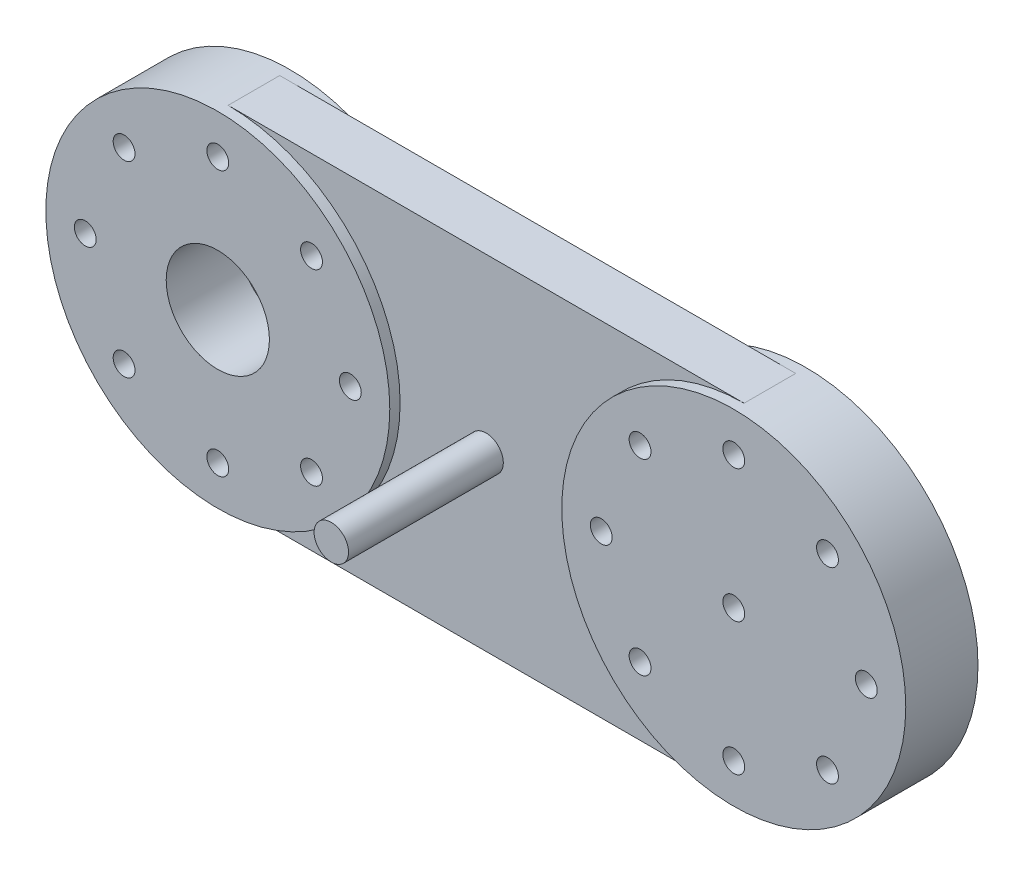
ISO-10303-21;
HEADER;
FILE_DESCRIPTION(('STEP AP214'),'2;1');
FILE_NAME('part.step','',(''),(''),'','','');
FILE_SCHEMA(('AUTOMOTIVE_DESIGN { 1 0 10303 214 1 1 1 1 }'));
ENDSEC;
DATA;
#1=APPLICATION_CONTEXT('core data for automotive mechanical design processes');
#2=APPLICATION_PROTOCOL_DEFINITION('international standard','automotive_design',2000,#1);
#3=PRODUCT_CONTEXT('',#1,'mechanical');
#4=PRODUCT('Part','Part','',(#3));
#5=PRODUCT_RELATED_PRODUCT_CATEGORY('part','',(#4));
#6=PRODUCT_DEFINITION_FORMATION('','',#4);
#7=PRODUCT_DEFINITION_CONTEXT('part definition',#1,'design');
#8=PRODUCT_DEFINITION('design','',#6,#7);
#9=PRODUCT_DEFINITION_SHAPE('','',#8);
#10=(LENGTH_UNIT() NAMED_UNIT(*) SI_UNIT(.MILLI.,.METRE.));
#11=(NAMED_UNIT(*) PLANE_ANGLE_UNIT() SI_UNIT($,.RADIAN.));
#12=(NAMED_UNIT(*) SI_UNIT($,.STERADIAN.) SOLID_ANGLE_UNIT());
#13=UNCERTAINTY_MEASURE_WITH_UNIT(LENGTH_MEASURE(1.E-05),#10,'distance_accuracy_value','');
#14=(GEOMETRIC_REPRESENTATION_CONTEXT(3) GLOBAL_UNCERTAINTY_ASSIGNED_CONTEXT((#13)) GLOBAL_UNIT_ASSIGNED_CONTEXT((#10,
#11,#12)) REPRESENTATION_CONTEXT('',''));
#15=CARTESIAN_POINT('',(0.,0.,0.));
#16=DIRECTION('',(0.,0.,1.));
#17=DIRECTION('',(1.,0.,0.));
#18=AXIS2_PLACEMENT_3D('',#15,#16,#17);
#19=CARTESIAN_POINT('',(0.,0.,-15.));
#20=DIRECTION('',(0.,1.,0.));
#21=DIRECTION('',(-1.,0.,0.));
#22=AXIS2_PLACEMENT_3D('',#19,#20,#21);
#23=PLANE('',#22);
#24=DIRECTION('',(-1.,0.,0.));
#25=VECTOR('',#24,1.);
#26=CARTESIAN_POINT('',(0.,0.,0.));
#27=LINE('',#26,#25);
#28=CARTESIAN_POINT('',(0.,0.,0.));
#29=VERTEX_POINT('',#28);
#30=CARTESIAN_POINT('',(-150.,0.,0.));
#31=VERTEX_POINT('',#30);
#32=EDGE_CURVE('E71',#29,#31,#27,.T.);
#33=ORIENTED_EDGE('',*,*,#32,.T.);
#34=DIRECTION('',(0.,0.,1.));
#35=VECTOR('',#34,1.);
#36=CARTESIAN_POINT('',(-150.,0.,-15.));
#37=LINE('',#36,#35);
#38=CARTESIAN_POINT('',(-150.,0.,-15.));
#39=VERTEX_POINT('',#38);
#40=EDGE_CURVE('E86',#39,#31,#37,.T.);
#41=ORIENTED_EDGE('',*,*,#40,.F.);
#42=DIRECTION('',(-1.,0.,0.));
#43=VECTOR('',#42,1.);
#44=CARTESIAN_POINT('',(0.,0.,-15.));
#45=LINE('',#44,#43);
#46=CARTESIAN_POINT('',(0.,0.,-15.));
#47=VERTEX_POINT('',#46);
#48=EDGE_CURVE('E83',#47,#39,#45,.T.);
#49=ORIENTED_EDGE('',*,*,#48,.F.);
#50=DIRECTION('',(0.,0.,1.));
#51=VECTOR('',#50,1.);
#52=CARTESIAN_POINT('',(0.,0.,-15.));
#53=LINE('',#52,#51);
#54=EDGE_CURVE('E44',#47,#29,#53,.T.);
#55=ORIENTED_EDGE('',*,*,#54,.T.);
#56=EDGE_LOOP('',(#33,#41,#49,#55));
#57=FACE_BOUND('',#56,.T.);
#58=ADVANCED_FACE('F36',(#57),#23,.F.);
#59=CARTESIAN_POINT('',(0.,100.,-15.));
#60=DIRECTION('',(0.,1.,0.));
#61=DIRECTION('',(-1.,0.,0.));
#62=AXIS2_PLACEMENT_3D('',#59,#60,#61);
#63=PLANE('',#62);
#64=DIRECTION('',(-1.,0.,0.));
#65=VECTOR('',#64,1.);
#66=CARTESIAN_POINT('',(0.,100.,0.));
#67=LINE('',#66,#65);
#68=CARTESIAN_POINT('',(0.,100.,0.));
#69=VERTEX_POINT('',#68);
#70=CARTESIAN_POINT('',(-150.,100.,0.));
#71=VERTEX_POINT('',#70);
#72=EDGE_CURVE('E79',#69,#71,#67,.T.);
#73=ORIENTED_EDGE('',*,*,#72,.F.);
#74=DIRECTION('',(0.,0.,1.));
#75=VECTOR('',#74,1.);
#76=CARTESIAN_POINT('',(0.,100.,-15.));
#77=LINE('',#76,#75);
#78=CARTESIAN_POINT('',(0.,100.,-15.));
#79=VERTEX_POINT('',#78);
#80=EDGE_CURVE('E90',#79,#69,#77,.T.);
#81=ORIENTED_EDGE('',*,*,#80,.F.);
#82=DIRECTION('',(-1.,0.,0.));
#83=VECTOR('',#82,1.);
#84=CARTESIAN_POINT('',(0.,100.,-15.));
#85=LINE('',#84,#83);
#86=CARTESIAN_POINT('',(-150.,100.,-15.));
#87=VERTEX_POINT('',#86);
#88=EDGE_CURVE('E78',#79,#87,#85,.T.);
#89=ORIENTED_EDGE('',*,*,#88,.T.);
#90=DIRECTION('',(0.,0.,1.));
#91=VECTOR('',#90,1.);
#92=CARTESIAN_POINT('',(-150.,100.,-15.));
#93=LINE('',#92,#91);
#94=EDGE_CURVE('E108',#87,#71,#93,.T.);
#95=ORIENTED_EDGE('',*,*,#94,.T.);
#96=EDGE_LOOP('',(#73,#81,#89,#95));
#97=FACE_BOUND('',#96,.T.);
#98=ADVANCED_FACE('F38',(#97),#63,.T.);
#99=CARTESIAN_POINT('',(0.,0.,-15.));
#100=DIRECTION('',(0.,0.,1.));
#101=DIRECTION('',(1.,0.,0.));
#102=AXIS2_PLACEMENT_3D('',#99,#100,#101);
#103=PLANE('',#102);
#104=ORIENTED_EDGE('',*,*,#48,.T.);
#105=CARTESIAN_POINT('',(-150.,50.,-15.));
#106=DIRECTION('',(0.,0.,1.));
#107=DIRECTION('',(1.,0.,0.));
#108=AXIS2_PLACEMENT_3D('',#105,#106,#107);
#109=CIRCLE('',#108,50.);
#110=EDGE_CURVE('E92',#39,#87,#109,.T.);
#111=ORIENTED_EDGE('',*,*,#110,.T.);
#112=ORIENTED_EDGE('',*,*,#88,.F.);
#113=CARTESIAN_POINT('',(0.,50.,-15.));
#114=DIRECTION('',(0.,0.,1.));
#115=DIRECTION('',(1.,0.,0.));
#116=AXIS2_PLACEMENT_3D('',#113,#114,#115);
#117=CIRCLE('',#116,50.);
#118=EDGE_CURVE('E97',#79,#47,#117,.T.);
#119=ORIENTED_EDGE('',*,*,#118,.T.);
#120=EDGE_LOOP('',(#104,#111,#112,#119));
#121=FACE_BOUND('',#120,.T.);
#122=ADVANCED_FACE('F117',(#121),#103,.F.);
#123=CARTESIAN_POINT('',(0.,0.,0.));
#124=DIRECTION('',(0.,0.,1.));
#125=DIRECTION('',(1.,0.,0.));
#126=AXIS2_PLACEMENT_3D('',#123,#124,#125);
#127=PLANE('',#126);
#128=CARTESIAN_POINT('',(-150.,50.,0.));
#129=DIRECTION('',(0.,0.,1.));
#130=DIRECTION('',(1.,0.,0.));
#131=AXIS2_PLACEMENT_3D('',#128,#129,#130);
#132=CIRCLE('',#131,50.);
#133=EDGE_CURVE('E11',#31,#71,#132,.T.);
#134=ORIENTED_EDGE('',*,*,#133,.F.);
#135=ORIENTED_EDGE('',*,*,#32,.F.);
#136=CARTESIAN_POINT('',(0.,50.,0.));
#137=DIRECTION('',(0.,0.,1.));
#138=DIRECTION('',(1.,0.,0.));
#139=AXIS2_PLACEMENT_3D('',#136,#137,#138);
#140=CIRCLE('',#139,50.);
#141=EDGE_CURVE('E54',#69,#29,#140,.T.);
#142=ORIENTED_EDGE('',*,*,#141,.F.);
#143=ORIENTED_EDGE('',*,*,#72,.T.);
#144=EDGE_LOOP('',(#134,#135,#142,#143));
#145=FACE_BOUND('',#144,.T.);
#146=CARTESIAN_POINT('',(-75.,50.,0.));
#147=DIRECTION('',(0.,0.,1.));
#148=DIRECTION('',(1.,0.,0.));
#149=AXIS2_PLACEMENT_3D('',#146,#147,#148);
#150=CIRCLE('',#149,5.00000000000001);
#151=CARTESIAN_POINT('',(-80.,50.,0.));
#152=VERTEX_POINT('',#151);
#153=EDGE_CURVE('E91',#152,#152,#150,.T.);
#154=ORIENTED_EDGE('',*,*,#153,.F.);
#155=EDGE_LOOP('',(#154));
#156=FACE_BOUND('',#155,.T.);
#157=ADVANCED_FACE('F73',(#145,#156),#127,.T.);
#158=CARTESIAN_POINT('',(-75.,50.,45.));
#159=DIRECTION('',(0.,0.,-1.));
#160=DIRECTION('',(-1.,0.,0.));
#161=AXIS2_PLACEMENT_3D('',#158,#159,#160);
#162=CYLINDRICAL_SURFACE('',#161,5.00000000000001);
#163=CARTESIAN_POINT('',(-75.,50.,45.));
#164=DIRECTION('',(0.,0.,1.));
#165=DIRECTION('',(1.,0.,0.));
#166=AXIS2_PLACEMENT_3D('',#163,#164,#165);
#167=CIRCLE('',#166,5.00000000000001);
#168=CARTESIAN_POINT('',(-80.,50.,45.));
#169=VERTEX_POINT('',#168);
#170=EDGE_CURVE('E95',#169,#169,#167,.T.);
#171=CARTESIAN_POINT('',(-80.,50.,45.));
#172=CARTESIAN_POINT('',(-80.,50.,44.53125));
#173=CARTESIAN_POINT('',(-80.,50.,44.0625));
#174=CARTESIAN_POINT('',(-80.,50.,43.125));
#175=CARTESIAN_POINT('',(-80.,50.,42.65625));
#176=CARTESIAN_POINT('',(-80.,50.,41.71875));
#177=CARTESIAN_POINT('',(-80.,50.,41.25));
#178=CARTESIAN_POINT('',(-80.,50.,40.3125));
#179=CARTESIAN_POINT('',(-80.,50.,39.84375));
#180=CARTESIAN_POINT('',(-80.,50.,38.90625));
#181=CARTESIAN_POINT('',(-80.,50.,38.4375));
#182=CARTESIAN_POINT('',(-80.,50.,37.5));
#183=CARTESIAN_POINT('',(-80.,50.,37.03125));
#184=CARTESIAN_POINT('',(-80.,50.,36.09375));
#185=CARTESIAN_POINT('',(-80.,50.,35.625));
#186=CARTESIAN_POINT('',(-80.,50.,34.6875));
#187=CARTESIAN_POINT('',(-80.,50.,34.21875));
#188=CARTESIAN_POINT('',(-80.,50.,33.28125));
#189=CARTESIAN_POINT('',(-80.,50.,32.8125));
#190=CARTESIAN_POINT('',(-80.,50.,31.875));
#191=CARTESIAN_POINT('',(-80.,50.,31.40625));
#192=CARTESIAN_POINT('',(-80.,50.,30.46875));
#193=CARTESIAN_POINT('',(-80.,50.,30.));
#194=CARTESIAN_POINT('',(-80.,50.,29.0625));
#195=CARTESIAN_POINT('',(-80.,50.,28.59375));
#196=CARTESIAN_POINT('',(-80.,50.,27.65625));
#197=CARTESIAN_POINT('',(-80.,50.,27.1875));
#198=CARTESIAN_POINT('',(-80.,50.,26.25));
#199=CARTESIAN_POINT('',(-80.,50.,25.78125));
#200=CARTESIAN_POINT('',(-80.,50.,24.84375));
#201=CARTESIAN_POINT('',(-80.,50.,24.375));
#202=CARTESIAN_POINT('',(-80.,50.,23.4375));
#203=CARTESIAN_POINT('',(-80.,50.,22.96875));
#204=CARTESIAN_POINT('',(-80.,50.,22.03125));
#205=CARTESIAN_POINT('',(-80.,50.,21.5625));
#206=CARTESIAN_POINT('',(-80.,50.,20.625));
#207=CARTESIAN_POINT('',(-80.,50.,20.15625));
#208=CARTESIAN_POINT('',(-80.,50.,19.21875));
#209=CARTESIAN_POINT('',(-80.,50.,18.75));
#210=CARTESIAN_POINT('',(-80.,50.,17.8125));
#211=CARTESIAN_POINT('',(-80.,50.,17.34375));
#212=CARTESIAN_POINT('',(-80.,50.,16.40625));
#213=CARTESIAN_POINT('',(-80.,50.,15.9375));
#214=CARTESIAN_POINT('',(-80.,50.,15.));
#215=CARTESIAN_POINT('',(-80.,50.,14.53125));
#216=CARTESIAN_POINT('',(-80.,50.,13.59375));
#217=CARTESIAN_POINT('',(-80.,50.,13.125));
#218=CARTESIAN_POINT('',(-80.,50.,12.1875));
#219=CARTESIAN_POINT('',(-80.,50.,11.71875));
#220=CARTESIAN_POINT('',(-80.,50.,10.78125));
#221=CARTESIAN_POINT('',(-80.,50.,10.3125));
#222=CARTESIAN_POINT('',(-80.,50.,9.375));
#223=CARTESIAN_POINT('',(-80.,50.,8.90625));
#224=CARTESIAN_POINT('',(-80.,50.,7.96874999999999));
#225=CARTESIAN_POINT('',(-80.,50.,7.5));
#226=CARTESIAN_POINT('',(-80.,50.,6.5625));
#227=CARTESIAN_POINT('',(-80.,50.,6.09375));
#228=CARTESIAN_POINT('',(-80.,50.,5.15625));
#229=CARTESIAN_POINT('',(-80.,50.,4.68749999999999));
#230=CARTESIAN_POINT('',(-80.,50.,3.74999999999999));
#231=CARTESIAN_POINT('',(-80.,50.,3.28124999999999));
#232=CARTESIAN_POINT('',(-80.,50.,2.34374999999999));
#233=CARTESIAN_POINT('',(-80.,50.,1.87499999999999));
#234=CARTESIAN_POINT('',(-80.,50.,0.937499999999992));
#235=CARTESIAN_POINT('',(-80.,50.,0.468749999999993));
#236=CARTESIAN_POINT('',(-80.,50.,0.));
#237=B_SPLINE_CURVE_WITH_KNOTS('',3,(#171,#172,#173,#174,#175,#176,#177,#178,#179,#180,#181,
#182,#183,#184,#185,#186,#187,#188,#189,#190,#191,#192,#193,#194,#195,#196,#197,#198,#199,#200,
#201,#202,#203,#204,#205,#206,#207,#208,#209,#210,#211,#212,#213,#214,#215,#216,#217,#218,#219,
#220,#221,#222,#223,#224,#225,#226,#227,#228,#229,#230,#231,#232,#233,#234,#235,#236),
.UNSPECIFIED.,.F.,.F.,(4,2,2,2,2,2,2,2,2,2,2,2,2,2,2,2,2,2,2,2,2,2,2,2,2,2,2,2,2,2,2,2,4),(0.,
1.40625,2.8125,4.21875000000001,5.62500000000001,7.03125,8.4375,9.84375000000001,11.25,12.65625,
14.0625,15.46875,16.875,18.28125,19.6875,21.09375,22.5,23.90625,25.3125,26.71875,28.125,
29.53125,30.9375,32.34375,33.75,35.15625,36.5625,37.96875,39.375,40.78125,42.1875,43.59375,45.),.UNSPECIFIED.);
#238=EDGE_CURVE('BSEAM287',#169,#152,#237,.T.);
#239=ORIENTED_EDGE('',*,*,#170,.F.);
#240=ORIENTED_EDGE('',*,*,#153,.T.);
#241=ORIENTED_EDGE('',*,*,#238,.T.);
#242=ORIENTED_EDGE('',*,*,#238,.F.);
#243=EDGE_LOOP('',(#239,#241,#240,#242));
#244=FACE_BOUND('',#243,.T.);
#245=ADVANCED_FACE('F287',(#244),#162,.T.);
#246=CARTESIAN_POINT('',(-75.,50.,45.));
#247=DIRECTION('',(0.,0.,1.));
#248=DIRECTION('',(1.,0.,0.));
#249=AXIS2_PLACEMENT_3D('',#246,#247,#248);
#250=PLANE('',#249);
#251=ORIENTED_EDGE('',*,*,#170,.T.);
#252=EDGE_LOOP('',(#251));
#253=FACE_BOUND('',#252,.T.);
#254=ADVANCED_FACE('F292',(#253),#250,.T.);
#255=CARTESIAN_POINT('',(-150.,50.,3.));
#256=DIRECTION('',(0.,0.,-1.));
#257=DIRECTION('',(-1.,0.,0.));
#258=AXIS2_PLACEMENT_3D('',#255,#256,#257);
#259=CYLINDRICAL_SURFACE('',#258,50.);
#260=CARTESIAN_POINT('',(-150.,50.,3.));
#261=DIRECTION('',(0.,0.,1.));
#262=DIRECTION('',(1.,0.,0.));
#263=AXIS2_PLACEMENT_3D('',#260,#261,#262);
#264=CIRCLE('',#263,50.);
#265=CARTESIAN_POINT('',(-100.,50.,3.));
#266=VERTEX_POINT('',#265);
#267=EDGE_CURVE('E143',#266,#266,#264,.T.);
#268=ORIENTED_EDGE('',*,*,#267,.F.);
#269=EDGE_LOOP('',(#268));
#270=FACE_BOUND('',#269,.T.);
#271=CARTESIAN_POINT('',(-150.,50.,-17.9999999999999));
#272=DIRECTION('',(0.,0.,1.));
#273=DIRECTION('',(1.,0.,0.));
#274=AXIS2_PLACEMENT_3D('',#271,#272,#273);
#275=CIRCLE('',#274,50.);
#276=CARTESIAN_POINT('',(-100.,50.,-17.9999999999999));
#277=VERTEX_POINT('',#276);
#278=EDGE_CURVE('E170',#277,#277,#275,.T.);
#279=ORIENTED_EDGE('',*,*,#278,.T.);
#280=EDGE_LOOP('',(#279));
#281=FACE_BOUND('',#280,.T.);
#282=ORIENTED_EDGE('',*,*,#94,.F.);
#283=ORIENTED_EDGE('',*,*,#110,.F.);
#284=ORIENTED_EDGE('',*,*,#40,.T.);
#285=ORIENTED_EDGE('',*,*,#133,.T.);
#286=EDGE_LOOP('',(#282,#283,#284,#285));
#287=FACE_BOUND('',#286,.T.);
#288=ADVANCED_FACE('F115',(#270,#281,#287),#259,.T.);
#289=CARTESIAN_POINT('',(-122.754935969732,22.7549359697323,3.));
#290=DIRECTION('',(0.,0.,-1.));
#291=DIRECTION('',(-1.,0.,0.));
#292=AXIS2_PLACEMENT_3D('',#289,#290,#291);
#293=CYLINDRICAL_SURFACE('',#292,3.175);
#294=CARTESIAN_POINT('',(-122.754935969732,22.7549359697323,3.));
#295=DIRECTION('',(0.,0.,1.));
#296=DIRECTION('',(1.,0.,0.));
#297=AXIS2_PLACEMENT_3D('',#294,#295,#296);
#298=CIRCLE('',#297,3.175);
#299=CARTESIAN_POINT('',(-119.579935969732,22.7549359697323,3.));
#300=VERTEX_POINT('',#299);
#301=EDGE_CURVE('E120',#300,#300,#298,.T.);
#302=ORIENTED_EDGE('',*,*,#301,.T.);
#303=EDGE_LOOP('',(#302));
#304=FACE_BOUND('',#303,.T.);
#305=CARTESIAN_POINT('',(-122.754935969732,22.7549359697323,-17.9999999999999));
#306=DIRECTION('',(0.,0.,1.));
#307=DIRECTION('',(1.,0.,0.));
#308=AXIS2_PLACEMENT_3D('',#305,#306,#307);
#309=CIRCLE('',#308,3.175);
#310=CARTESIAN_POINT('',(-119.579935969732,22.7549359697323,-17.9999999999999));
#311=VERTEX_POINT('',#310);
#312=EDGE_CURVE('E149',#311,#311,#309,.T.);
#313=ORIENTED_EDGE('',*,*,#312,.F.);
#314=EDGE_LOOP('',(#313));
#315=FACE_BOUND('',#314,.T.);
#316=ADVANCED_FACE('F298',(#304,#315),#293,.F.);
#317=CARTESIAN_POINT('',(-122.754935969734,77.2450640302665,3.));
#318=DIRECTION('',(0.,0.,-1.));
#319=DIRECTION('',(-1.,0.,0.));
#320=AXIS2_PLACEMENT_3D('',#317,#318,#319);
#321=CYLINDRICAL_SURFACE('',#320,3.175);
#322=CARTESIAN_POINT('',(-122.754935969734,77.2450640302665,3.));
#323=DIRECTION('',(0.,0.,1.));
#324=DIRECTION('',(1.,0.,0.));
#325=AXIS2_PLACEMENT_3D('',#322,#323,#324);
#326=CIRCLE('',#325,3.175);
#327=CARTESIAN_POINT('',(-119.579935969734,77.2450640302665,3.));
#328=VERTEX_POINT('',#327);
#329=EDGE_CURVE('E125',#328,#328,#326,.T.);
#330=ORIENTED_EDGE('',*,*,#329,.T.);
#331=EDGE_LOOP('',(#330));
#332=FACE_BOUND('',#331,.T.);
#333=CARTESIAN_POINT('',(-122.754935969734,77.2450640302665,-17.9999999999999));
#334=DIRECTION('',(0.,0.,1.));
#335=DIRECTION('',(1.,0.,0.));
#336=AXIS2_PLACEMENT_3D('',#333,#334,#335);
#337=CIRCLE('',#336,3.175);
#338=CARTESIAN_POINT('',(-119.579935969734,77.2450640302665,-17.9999999999999));
#339=VERTEX_POINT('',#338);
#340=EDGE_CURVE('E152',#339,#339,#337,.T.);
#341=ORIENTED_EDGE('',*,*,#340,.F.);
#342=EDGE_LOOP('',(#341));
#343=FACE_BOUND('',#342,.T.);
#344=ADVANCED_FACE('F315',(#332,#343),#321,.F.);
#345=CARTESIAN_POINT('',(-111.469660940673,50.0000000000001,3.));
#346=DIRECTION('',(0.,0.,-1.));
#347=DIRECTION('',(-1.,0.,0.));
#348=AXIS2_PLACEMENT_3D('',#345,#346,#347);
#349=CYLINDRICAL_SURFACE('',#348,3.175);
#350=CARTESIAN_POINT('',(-111.469660940673,50.0000000000001,3.));
#351=DIRECTION('',(0.,0.,1.));
#352=DIRECTION('',(1.,0.,0.));
#353=AXIS2_PLACEMENT_3D('',#350,#351,#352);
#354=CIRCLE('',#353,3.175);
#355=CARTESIAN_POINT('',(-108.294660940673,50.0000000000001,3.));
#356=VERTEX_POINT('',#355);
#357=EDGE_CURVE('E128',#356,#356,#354,.T.);
#358=ORIENTED_EDGE('',*,*,#357,.T.);
#359=EDGE_LOOP('',(#358));
#360=FACE_BOUND('',#359,.T.);
#361=CARTESIAN_POINT('',(-111.469660940673,50.0000000000001,-17.9999999999999));
#362=DIRECTION('',(0.,0.,1.));
#363=DIRECTION('',(1.,0.,0.));
#364=AXIS2_PLACEMENT_3D('',#361,#362,#363);
#365=CIRCLE('',#364,3.175);
#366=CARTESIAN_POINT('',(-108.294660940673,50.0000000000001,-17.9999999999999));
#367=VERTEX_POINT('',#366);
#368=EDGE_CURVE('E155',#367,#367,#365,.T.);
#369=ORIENTED_EDGE('',*,*,#368,.F.);
#370=EDGE_LOOP('',(#369));
#371=FACE_BOUND('',#370,.T.);
#372=ADVANCED_FACE('F311',(#360,#371),#349,.F.);
#373=CARTESIAN_POINT('',(-150.000000000001,88.5303390593257,3.));
#374=DIRECTION('',(0.,0.,-1.));
#375=DIRECTION('',(-1.,0.,0.));
#376=AXIS2_PLACEMENT_3D('',#373,#374,#375);
#377=CYLINDRICAL_SURFACE('',#376,3.17499999999999);
#378=CARTESIAN_POINT('',(-150.000000000001,88.5303390593257,3.));
#379=DIRECTION('',(0.,0.,1.));
#380=DIRECTION('',(1.,0.,0.));
#381=AXIS2_PLACEMENT_3D('',#378,#379,#380);
#382=CIRCLE('',#381,3.17499999999999);
#383=CARTESIAN_POINT('',(-146.825000000001,88.5303390593257,3.));
#384=VERTEX_POINT('',#383);
#385=EDGE_CURVE('E131',#384,#384,#382,.T.);
#386=ORIENTED_EDGE('',*,*,#385,.T.);
#387=EDGE_LOOP('',(#386));
#388=FACE_BOUND('',#387,.T.);
#389=CARTESIAN_POINT('',(-150.000000000001,88.5303390593257,-17.9999999999999));
#390=DIRECTION('',(0.,0.,1.));
#391=DIRECTION('',(1.,0.,0.));
#392=AXIS2_PLACEMENT_3D('',#389,#390,#391);
#393=CIRCLE('',#392,3.17499999999999);
#394=CARTESIAN_POINT('',(-146.825000000001,88.5303390593257,-17.9999999999999));
#395=VERTEX_POINT('',#394);
#396=EDGE_CURVE('E158',#395,#395,#393,.T.);
#397=ORIENTED_EDGE('',*,*,#396,.F.);
#398=EDGE_LOOP('',(#397));
#399=FACE_BOUND('',#398,.T.);
#400=ADVANCED_FACE('F307',(#388,#399),#377,.F.);
#401=CARTESIAN_POINT('',(-188.530339059327,49.9999999999969,3.));
#402=DIRECTION('',(0.,0.,-1.));
#403=DIRECTION('',(-1.,0.,0.));
#404=AXIS2_PLACEMENT_3D('',#401,#402,#403);
#405=CYLINDRICAL_SURFACE('',#404,3.17500000000002);
#406=CARTESIAN_POINT('',(-188.530339059327,49.9999999999969,3.));
#407=DIRECTION('',(0.,0.,1.));
#408=DIRECTION('',(1.,0.,0.));
#409=AXIS2_PLACEMENT_3D('',#406,#407,#408);
#410=CIRCLE('',#409,3.17500000000002);
#411=CARTESIAN_POINT('',(-185.355339059327,49.9999999999969,3.));
#412=VERTEX_POINT('',#411);
#413=EDGE_CURVE('E134',#412,#412,#410,.T.);
#414=ORIENTED_EDGE('',*,*,#413,.T.);
#415=EDGE_LOOP('',(#414));
#416=FACE_BOUND('',#415,.T.);
#417=CARTESIAN_POINT('',(-188.530339059327,49.9999999999969,-17.9999999999999));
#418=DIRECTION('',(0.,0.,1.));
#419=DIRECTION('',(1.,0.,0.));
#420=AXIS2_PLACEMENT_3D('',#417,#418,#419);
#421=CIRCLE('',#420,3.17500000000002);
#422=CARTESIAN_POINT('',(-185.355339059327,49.9999999999969,-17.9999999999999));
#423=VERTEX_POINT('',#422);
#424=EDGE_CURVE('E161',#423,#423,#421,.T.);
#425=ORIENTED_EDGE('',*,*,#424,.F.);
#426=EDGE_LOOP('',(#425));
#427=FACE_BOUND('',#426,.T.);
#428=ADVANCED_FACE('F303',(#416,#427),#405,.F.);
#429=CARTESIAN_POINT('',(-177.245064030266,22.7549359697301,3.));
#430=DIRECTION('',(0.,0.,-1.));
#431=DIRECTION('',(-1.,0.,0.));
#432=AXIS2_PLACEMENT_3D('',#429,#430,#431);
#433=CYLINDRICAL_SURFACE('',#432,3.17500000000001);
#434=CARTESIAN_POINT('',(-177.245064030266,22.7549359697301,3.));
#435=DIRECTION('',(0.,0.,1.));
#436=DIRECTION('',(1.,0.,0.));
#437=AXIS2_PLACEMENT_3D('',#434,#435,#436);
#438=CIRCLE('',#437,3.17500000000001);
#439=CARTESIAN_POINT('',(-174.070064030266,22.7549359697301,3.));
#440=VERTEX_POINT('',#439);
#441=EDGE_CURVE('E137',#440,#440,#438,.T.);
#442=ORIENTED_EDGE('',*,*,#441,.T.);
#443=EDGE_LOOP('',(#442));
#444=FACE_BOUND('',#443,.T.);
#445=CARTESIAN_POINT('',(-177.245064030266,22.7549359697301,-17.9999999999999));
#446=DIRECTION('',(0.,0.,1.));
#447=DIRECTION('',(1.,0.,0.));
#448=AXIS2_PLACEMENT_3D('',#445,#446,#447);
#449=CIRCLE('',#448,3.17500000000001);
#450=CARTESIAN_POINT('',(-174.070064030266,22.7549359697301,-17.9999999999999));
#451=VERTEX_POINT('',#450);
#452=EDGE_CURVE('E164',#451,#451,#449,.T.);
#453=ORIENTED_EDGE('',*,*,#452,.F.);
#454=EDGE_LOOP('',(#453));
#455=FACE_BOUND('',#454,.T.);
#456=ADVANCED_FACE('F276',(#444,#455),#433,.F.);
#457=CARTESIAN_POINT('',(-149.999999999998,11.469660940671,3.));
#458=DIRECTION('',(0.,0.,-1.));
#459=DIRECTION('',(-1.,0.,0.));
#460=AXIS2_PLACEMENT_3D('',#457,#458,#459);
#461=CYLINDRICAL_SURFACE('',#460,3.175);
#462=CARTESIAN_POINT('',(-149.999999999998,11.469660940671,3.));
#463=DIRECTION('',(0.,0.,1.));
#464=DIRECTION('',(1.,0.,0.));
#465=AXIS2_PLACEMENT_3D('',#462,#463,#464);
#466=CIRCLE('',#465,3.175);
#467=CARTESIAN_POINT('',(-146.824999999998,11.469660940671,3.));
#468=VERTEX_POINT('',#467);
#469=EDGE_CURVE('E140',#468,#468,#466,.T.);
#470=ORIENTED_EDGE('',*,*,#469,.T.);
#471=EDGE_LOOP('',(#470));
#472=FACE_BOUND('',#471,.T.);
#473=CARTESIAN_POINT('',(-149.999999999998,11.469660940671,-17.9999999999999));
#474=DIRECTION('',(0.,0.,1.));
#475=DIRECTION('',(1.,0.,0.));
#476=AXIS2_PLACEMENT_3D('',#473,#474,#475);
#477=CIRCLE('',#476,3.175);
#478=CARTESIAN_POINT('',(-146.824999999998,11.469660940671,-17.9999999999999));
#479=VERTEX_POINT('',#478);
#480=EDGE_CURVE('E167',#479,#479,#477,.T.);
#481=ORIENTED_EDGE('',*,*,#480,.F.);
#482=EDGE_LOOP('',(#481));
#483=FACE_BOUND('',#482,.T.);
#484=ADVANCED_FACE('F267',(#472,#483),#461,.F.);
#485=CARTESIAN_POINT('',(-177.245064030268,77.2450640302647,3.));
#486=DIRECTION('',(0.,0.,-1.));
#487=DIRECTION('',(-1.,0.,0.));
#488=AXIS2_PLACEMENT_3D('',#485,#486,#487);
#489=CYLINDRICAL_SURFACE('',#488,3.175);
#490=CARTESIAN_POINT('',(-177.245064030268,77.2450640302647,3.));
#491=DIRECTION('',(0.,0.,1.));
#492=DIRECTION('',(1.,0.,0.));
#493=AXIS2_PLACEMENT_3D('',#490,#491,#492);
#494=CIRCLE('',#493,3.175);
#495=CARTESIAN_POINT('',(-174.070064030268,77.2450640302647,3.));
#496=VERTEX_POINT('',#495);
#497=EDGE_CURVE('E118',#496,#496,#494,.T.);
#498=ORIENTED_EDGE('',*,*,#497,.T.);
#499=EDGE_LOOP('',(#498));
#500=FACE_BOUND('',#499,.T.);
#501=CARTESIAN_POINT('',(-177.245064030268,77.2450640302647,-17.9999999999999));
#502=DIRECTION('',(0.,0.,1.));
#503=DIRECTION('',(1.,0.,0.));
#504=AXIS2_PLACEMENT_3D('',#501,#502,#503);
#505=CIRCLE('',#504,3.175);
#506=CARTESIAN_POINT('',(-174.070064030268,77.2450640302647,-17.9999999999999));
#507=VERTEX_POINT('',#506);
#508=EDGE_CURVE('E146',#507,#507,#505,.T.);
#509=ORIENTED_EDGE('',*,*,#508,.F.);
#510=EDGE_LOOP('',(#509));
#511=FACE_BOUND('',#510,.T.);
#512=ADVANCED_FACE('F265',(#500,#511),#489,.F.);
#513=CARTESIAN_POINT('',(0.,0.,3.));
#514=DIRECTION('',(0.,0.,1.));
#515=DIRECTION('',(1.,0.,0.));
#516=AXIS2_PLACEMENT_3D('',#513,#514,#515);
#517=PLANE('',#516);
#518=CARTESIAN_POINT('',(-150.,50.,3.));
#519=DIRECTION('',(0.,0.,1.));
#520=DIRECTION('',(1.,0.,0.));
#521=AXIS2_PLACEMENT_3D('',#518,#519,#520);
#522=CIRCLE('',#521,15.);
#523=CARTESIAN_POINT('',(-135.,50.,3.));
#524=VERTEX_POINT('',#523);
#525=EDGE_CURVE('E233',#524,#524,#522,.T.);
#526=ORIENTED_EDGE('',*,*,#525,.F.);
#527=EDGE_LOOP('',(#526));
#528=FACE_BOUND('',#527,.T.);
#529=ORIENTED_EDGE('',*,*,#267,.T.);
#530=EDGE_LOOP('',(#529));
#531=FACE_BOUND('',#530,.T.);
#532=ORIENTED_EDGE('',*,*,#469,.F.);
#533=EDGE_LOOP('',(#532));
#534=FACE_BOUND('',#533,.T.);
#535=ORIENTED_EDGE('',*,*,#441,.F.);
#536=EDGE_LOOP('',(#535));
#537=FACE_BOUND('',#536,.T.);
#538=ORIENTED_EDGE('',*,*,#413,.F.);
#539=EDGE_LOOP('',(#538));
#540=FACE_BOUND('',#539,.T.);
#541=ORIENTED_EDGE('',*,*,#385,.F.);
#542=EDGE_LOOP('',(#541));
#543=FACE_BOUND('',#542,.T.);
#544=ORIENTED_EDGE('',*,*,#357,.F.);
#545=EDGE_LOOP('',(#544));
#546=FACE_BOUND('',#545,.T.);
#547=ORIENTED_EDGE('',*,*,#329,.F.);
#548=EDGE_LOOP('',(#547));
#549=FACE_BOUND('',#548,.T.);
#550=ORIENTED_EDGE('',*,*,#301,.F.);
#551=EDGE_LOOP('',(#550));
#552=FACE_BOUND('',#551,.T.);
#553=ORIENTED_EDGE('',*,*,#497,.F.);
#554=EDGE_LOOP('',(#553));
#555=FACE_BOUND('',#554,.T.);
#556=ADVANCED_FACE('F245',(#528,#531,#534,#537,#540,#543,#546,#549,#552,#555),#517,.T.);
#557=CARTESIAN_POINT('',(0.,0.,-17.9999999999999));
#558=DIRECTION('',(0.,0.,1.));
#559=DIRECTION('',(1.,0.,0.));
#560=AXIS2_PLACEMENT_3D('',#557,#558,#559);
#561=PLANE('',#560);
#562=CARTESIAN_POINT('',(-150.,50.,-17.9999999999999));
#563=DIRECTION('',(0.,0.,-1.));
#564=DIRECTION('',(-1.,0.,0.));
#565=AXIS2_PLACEMENT_3D('',#562,#563,#564);
#566=CIRCLE('',#565,15.);
#567=CARTESIAN_POINT('',(-165.,50.,-17.9999999999999));
#568=VERTEX_POINT('',#567);
#569=EDGE_CURVE('E236',#568,#568,#566,.T.);
#570=ORIENTED_EDGE('',*,*,#569,.F.);
#571=EDGE_LOOP('',(#570));
#572=FACE_BOUND('',#571,.T.);
#573=ORIENTED_EDGE('',*,*,#278,.F.);
#574=EDGE_LOOP('',(#573));
#575=FACE_BOUND('',#574,.T.);
#576=ORIENTED_EDGE('',*,*,#480,.T.);
#577=EDGE_LOOP('',(#576));
#578=FACE_BOUND('',#577,.T.);
#579=ORIENTED_EDGE('',*,*,#452,.T.);
#580=EDGE_LOOP('',(#579));
#581=FACE_BOUND('',#580,.T.);
#582=ORIENTED_EDGE('',*,*,#424,.T.);
#583=EDGE_LOOP('',(#582));
#584=FACE_BOUND('',#583,.T.);
#585=ORIENTED_EDGE('',*,*,#396,.T.);
#586=EDGE_LOOP('',(#585));
#587=FACE_BOUND('',#586,.T.);
#588=ORIENTED_EDGE('',*,*,#368,.T.);
#589=EDGE_LOOP('',(#588));
#590=FACE_BOUND('',#589,.T.);
#591=ORIENTED_EDGE('',*,*,#340,.T.);
#592=EDGE_LOOP('',(#591));
#593=FACE_BOUND('',#592,.T.);
#594=ORIENTED_EDGE('',*,*,#312,.T.);
#595=EDGE_LOOP('',(#594));
#596=FACE_BOUND('',#595,.T.);
#597=ORIENTED_EDGE('',*,*,#508,.T.);
#598=EDGE_LOOP('',(#597));
#599=FACE_BOUND('',#598,.T.);
#600=ADVANCED_FACE('F242',(#572,#575,#578,#581,#584,#587,#590,#593,#596,#599),#561,.F.);
#601=CARTESIAN_POINT('',(0.,50.,3.));
#602=DIRECTION('',(0.,0.,-1.));
#603=DIRECTION('',(-1.,0.,0.));
#604=AXIS2_PLACEMENT_3D('',#601,#602,#603);
#605=CYLINDRICAL_SURFACE('',#604,50.);
#606=CARTESIAN_POINT('',(0.,50.,3.));
#607=DIRECTION('',(0.,0.,1.));
#608=DIRECTION('',(1.,0.,0.));
#609=AXIS2_PLACEMENT_3D('',#606,#607,#608);
#610=CIRCLE('',#609,50.);
#611=CARTESIAN_POINT('',(50.,50.,3.));
#612=VERTEX_POINT('',#611);
#613=EDGE_CURVE('E197',#612,#612,#610,.T.);
#614=ORIENTED_EDGE('',*,*,#613,.F.);
#615=EDGE_LOOP('',(#614));
#616=FACE_BOUND('',#615,.T.);
#617=CARTESIAN_POINT('',(0.,50.,-17.9999999999999));
#618=DIRECTION('',(0.,0.,1.));
#619=DIRECTION('',(1.,0.,0.));
#620=AXIS2_PLACEMENT_3D('',#617,#618,#619);
#621=CIRCLE('',#620,50.);
#622=CARTESIAN_POINT('',(50.,50.,-17.9999999999999));
#623=VERTEX_POINT('',#622);
#624=EDGE_CURVE('E227',#623,#623,#621,.T.);
#625=ORIENTED_EDGE('',*,*,#624,.T.);
#626=EDGE_LOOP('',(#625));
#627=FACE_BOUND('',#626,.T.);
#628=ORIENTED_EDGE('',*,*,#54,.F.);
#629=ORIENTED_EDGE('',*,*,#118,.F.);
#630=ORIENTED_EDGE('',*,*,#80,.T.);
#631=ORIENTED_EDGE('',*,*,#141,.T.);
#632=EDGE_LOOP('',(#628,#629,#630,#631));
#633=FACE_BOUND('',#632,.T.);
#634=ADVANCED_FACE('F89',(#616,#627,#633),#605,.T.);
#635=CARTESIAN_POINT('',(27.2450640302644,22.75493596973,3.));
#636=DIRECTION('',(0.,0.,-1.));
#637=DIRECTION('',(-1.,0.,0.));
#638=AXIS2_PLACEMENT_3D('',#635,#636,#637);
#639=CYLINDRICAL_SURFACE('',#638,3.17500000000004);
#640=CARTESIAN_POINT('',(27.2450640302644,22.75493596973,3.));
#641=DIRECTION('',(0.,0.,1.));
#642=DIRECTION('',(1.,0.,0.));
#643=AXIS2_PLACEMENT_3D('',#640,#641,#642);
#644=CIRCLE('',#643,3.17500000000004);
#645=CARTESIAN_POINT('',(30.4200640302644,22.75493596973,3.));
#646=VERTEX_POINT('',#645);
#647=EDGE_CURVE('E176',#646,#646,#644,.T.);
#648=ORIENTED_EDGE('',*,*,#647,.T.);
#649=EDGE_LOOP('',(#648));
#650=FACE_BOUND('',#649,.T.);
#651=CARTESIAN_POINT('',(27.2450640302644,22.75493596973,-17.9999999999999));
#652=DIRECTION('',(0.,0.,1.));
#653=DIRECTION('',(1.,0.,0.));
#654=AXIS2_PLACEMENT_3D('',#651,#652,#653);
#655=CIRCLE('',#654,3.17500000000004);
#656=CARTESIAN_POINT('',(30.4200640302644,22.75493596973,-17.9999999999999));
#657=VERTEX_POINT('',#656);
#658=EDGE_CURVE('E206',#657,#657,#655,.T.);
#659=ORIENTED_EDGE('',*,*,#658,.F.);
#660=EDGE_LOOP('',(#659));
#661=FACE_BOUND('',#660,.T.);
#662=ADVANCED_FACE('F368',(#650,#661),#639,.F.);
#663=CARTESIAN_POINT('',(27.2450640302702,77.2450640302641,3.));
#664=DIRECTION('',(0.,0.,-1.));
#665=DIRECTION('',(-1.,0.,0.));
#666=AXIS2_PLACEMENT_3D('',#663,#664,#665);
#667=CYLINDRICAL_SURFACE('',#666,3.17500000000004);
#668=CARTESIAN_POINT('',(27.2450640302702,77.2450640302641,3.));
#669=DIRECTION('',(0.,0.,1.));
#670=DIRECTION('',(1.,0.,0.));
#671=AXIS2_PLACEMENT_3D('',#668,#669,#670);
#672=CIRCLE('',#671,3.17500000000004);
#673=CARTESIAN_POINT('',(30.4200640302703,77.2450640302641,3.));
#674=VERTEX_POINT('',#673);
#675=EDGE_CURVE('E179',#674,#674,#672,.T.);
#676=ORIENTED_EDGE('',*,*,#675,.T.);
#677=EDGE_LOOP('',(#676));
#678=FACE_BOUND('',#677,.T.);
#679=CARTESIAN_POINT('',(27.2450640302702,77.2450640302641,-17.9999999999999));
#680=DIRECTION('',(0.,0.,1.));
#681=DIRECTION('',(1.,0.,0.));
#682=AXIS2_PLACEMENT_3D('',#679,#680,#681);
#683=CIRCLE('',#682,3.17500000000004);
#684=CARTESIAN_POINT('',(30.4200640302703,77.2450640302641,-17.9999999999999));
#685=VERTEX_POINT('',#684);
#686=EDGE_CURVE('E209',#685,#685,#683,.T.);
#687=ORIENTED_EDGE('',*,*,#686,.F.);
#688=EDGE_LOOP('',(#687));
#689=FACE_BOUND('',#688,.T.);
#690=ADVANCED_FACE('F379',(#678,#689),#667,.F.);
#691=CARTESIAN_POINT('',(-27.2450640302642,77.2450640302701,3.));
#692=DIRECTION('',(0.,0.,-1.));
#693=DIRECTION('',(-1.,0.,0.));
#694=AXIS2_PLACEMENT_3D('',#691,#692,#693);
#695=CYLINDRICAL_SURFACE('',#694,3.17500000000005);
#696=CARTESIAN_POINT('',(-27.2450640302642,77.2450640302701,3.));
#697=DIRECTION('',(0.,0.,1.));
#698=DIRECTION('',(1.,0.,0.));
#699=AXIS2_PLACEMENT_3D('',#696,#697,#698);
#700=CIRCLE('',#699,3.17500000000005);
#701=CARTESIAN_POINT('',(-24.0700640302641,77.2450640302701,3.));
#702=VERTEX_POINT('',#701);
#703=EDGE_CURVE('E182',#702,#702,#700,.T.);
#704=ORIENTED_EDGE('',*,*,#703,.T.);
#705=EDGE_LOOP('',(#704));
#706=FACE_BOUND('',#705,.T.);
#707=CARTESIAN_POINT('',(-27.2450640302642,77.2450640302701,-17.9999999999999));
#708=DIRECTION('',(0.,0.,1.));
#709=DIRECTION('',(1.,0.,0.));
#710=AXIS2_PLACEMENT_3D('',#707,#708,#709);
#711=CIRCLE('',#710,3.17500000000005);
#712=CARTESIAN_POINT('',(-24.0700640302641,77.2450640302701,-17.9999999999999));
#713=VERTEX_POINT('',#712);
#714=EDGE_CURVE('E212',#713,#713,#711,.T.);
#715=ORIENTED_EDGE('',*,*,#714,.F.);
#716=EDGE_LOOP('',(#715));
#717=FACE_BOUND('',#716,.T.);
#718=ADVANCED_FACE('F389',(#706,#717),#695,.F.);
#719=CARTESIAN_POINT('',(-27.24506403027,22.7549359697357,3.));
#720=DIRECTION('',(0.,0.,-1.));
#721=DIRECTION('',(-1.,0.,0.));
#722=AXIS2_PLACEMENT_3D('',#719,#720,#721);
#723=CYLINDRICAL_SURFACE('',#722,3.17500000000004);
#724=CARTESIAN_POINT('',(-27.24506403027,22.7549359697357,3.));
#725=DIRECTION('',(0.,0.,1.));
#726=DIRECTION('',(1.,0.,0.));
#727=AXIS2_PLACEMENT_3D('',#724,#725,#726);
#728=CIRCLE('',#727,3.17500000000004);
#729=CARTESIAN_POINT('',(-24.07006403027,22.7549359697357,3.));
#730=VERTEX_POINT('',#729);
#731=EDGE_CURVE('E185',#730,#730,#728,.T.);
#732=ORIENTED_EDGE('',*,*,#731,.T.);
#733=EDGE_LOOP('',(#732));
#734=FACE_BOUND('',#733,.T.);
#735=CARTESIAN_POINT('',(-27.24506403027,22.7549359697357,-17.9999999999999));
#736=DIRECTION('',(0.,0.,1.));
#737=DIRECTION('',(1.,0.,0.));
#738=AXIS2_PLACEMENT_3D('',#735,#736,#737);
#739=CIRCLE('',#738,3.17500000000004);
#740=CARTESIAN_POINT('',(-24.07006403027,22.7549359697357,-17.9999999999999));
#741=VERTEX_POINT('',#740);
#742=EDGE_CURVE('E215',#741,#741,#739,.T.);
#743=ORIENTED_EDGE('',*,*,#742,.F.);
#744=EDGE_LOOP('',(#743));
#745=FACE_BOUND('',#744,.T.);
#746=ADVANCED_FACE('F399',(#734,#745),#723,.F.);
#747=CARTESIAN_POINT('',(-38.5303390593272,50.0000000000041,3.));
#748=DIRECTION('',(0.,0.,-1.));
#749=DIRECTION('',(-1.,0.,0.));
#750=AXIS2_PLACEMENT_3D('',#747,#748,#749);
#751=CYLINDRICAL_SURFACE('',#750,3.17500000000004);
#752=CARTESIAN_POINT('',(-38.5303390593272,50.0000000000041,3.));
#753=DIRECTION('',(0.,0.,1.));
#754=DIRECTION('',(1.,0.,0.));
#755=AXIS2_PLACEMENT_3D('',#752,#753,#754);
#756=CIRCLE('',#755,3.17500000000004);
#757=CARTESIAN_POINT('',(-35.3553390593272,50.0000000000041,3.));
#758=VERTEX_POINT('',#757);
#759=EDGE_CURVE('E188',#758,#758,#756,.T.);
#760=ORIENTED_EDGE('',*,*,#759,.T.);
#761=EDGE_LOOP('',(#760));
#762=FACE_BOUND('',#761,.T.);
#763=CARTESIAN_POINT('',(-38.5303390593272,50.0000000000041,-17.9999999999999));
#764=DIRECTION('',(0.,0.,1.));
#765=DIRECTION('',(1.,0.,0.));
#766=AXIS2_PLACEMENT_3D('',#763,#764,#765);
#767=CIRCLE('',#766,3.17500000000004);
#768=CARTESIAN_POINT('',(-35.3553390593272,50.0000000000041,-17.9999999999999));
#769=VERTEX_POINT('',#768);
#770=EDGE_CURVE('E218',#769,#769,#767,.T.);
#771=ORIENTED_EDGE('',*,*,#770,.F.);
#772=EDGE_LOOP('',(#771));
#773=FACE_BOUND('',#772,.T.);
#774=ADVANCED_FACE('F409',(#762,#773),#751,.F.);
#775=CARTESIAN_POINT('',(-4.00374178255447E-12,11.4696609406728,3.));
#776=DIRECTION('',(0.,0.,-1.));
#777=DIRECTION('',(-1.,0.,0.));
#778=AXIS2_PLACEMENT_3D('',#775,#776,#777);
#779=CYLINDRICAL_SURFACE('',#778,3.17500000000004);
#780=CARTESIAN_POINT('',(-4.00374178255447E-12,11.4696609406728,3.));
#781=DIRECTION('',(0.,0.,1.));
#782=DIRECTION('',(1.,0.,0.));
#783=AXIS2_PLACEMENT_3D('',#780,#781,#782);
#784=CIRCLE('',#783,3.17500000000004);
#785=CARTESIAN_POINT('',(3.17499999999604,11.4696609406728,3.));
#786=VERTEX_POINT('',#785);
#787=EDGE_CURVE('E191',#786,#786,#784,.T.);
#788=ORIENTED_EDGE('',*,*,#787,.T.);
#789=EDGE_LOOP('',(#788));
#790=FACE_BOUND('',#789,.T.);
#791=CARTESIAN_POINT('',(-4.00374178255447E-12,11.4696609406728,-17.9999999999999));
#792=DIRECTION('',(0.,0.,1.));
#793=DIRECTION('',(1.,0.,0.));
#794=AXIS2_PLACEMENT_3D('',#791,#792,#793);
#795=CIRCLE('',#794,3.17500000000004);
#796=CARTESIAN_POINT('',(3.17499999999604,11.4696609406728,-17.9999999999999));
#797=VERTEX_POINT('',#796);
#798=EDGE_CURVE('E221',#797,#797,#795,.T.);
#799=ORIENTED_EDGE('',*,*,#798,.F.);
#800=EDGE_LOOP('',(#799));
#801=FACE_BOUND('',#800,.T.);
#802=ADVANCED_FACE('F419',(#790,#801),#779,.F.);
#803=CARTESIAN_POINT('',(4.27435864480685E-12,88.5303390593272,3.));
#804=DIRECTION('',(0.,0.,-1.));
#805=DIRECTION('',(-1.,0.,0.));
#806=AXIS2_PLACEMENT_3D('',#803,#804,#805);
#807=CYLINDRICAL_SURFACE('',#806,3.17500000000003);
#808=CARTESIAN_POINT('',(4.27435864480685E-12,88.5303390593272,3.));
#809=DIRECTION('',(0.,0.,1.));
#810=DIRECTION('',(1.,0.,0.));
#811=AXIS2_PLACEMENT_3D('',#808,#809,#810);
#812=CIRCLE('',#811,3.17500000000003);
#813=CARTESIAN_POINT('',(3.1750000000043,88.5303390593272,3.));
#814=VERTEX_POINT('',#813);
#815=EDGE_CURVE('E194',#814,#814,#812,.T.);
#816=ORIENTED_EDGE('',*,*,#815,.T.);
#817=EDGE_LOOP('',(#816));
#818=FACE_BOUND('',#817,.T.);
#819=CARTESIAN_POINT('',(4.27435864480685E-12,88.5303390593272,-17.9999999999999));
#820=DIRECTION('',(0.,0.,1.));
#821=DIRECTION('',(1.,0.,0.));
#822=AXIS2_PLACEMENT_3D('',#819,#820,#821);
#823=CIRCLE('',#822,3.17500000000003);
#824=CARTESIAN_POINT('',(3.1750000000043,88.5303390593272,-17.9999999999999));
#825=VERTEX_POINT('',#824);
#826=EDGE_CURVE('E224',#825,#825,#823,.T.);
#827=ORIENTED_EDGE('',*,*,#826,.F.);
#828=EDGE_LOOP('',(#827));
#829=FACE_BOUND('',#828,.T.);
#830=ADVANCED_FACE('F429',(#818,#829),#807,.F.);
#831=CARTESIAN_POINT('',(0.,50.,3.));
#832=DIRECTION('',(0.,0.,-1.));
#833=DIRECTION('',(-1.,0.,0.));
#834=AXIS2_PLACEMENT_3D('',#831,#832,#833);
#835=CYLINDRICAL_SURFACE('',#834,3.175);
#836=CARTESIAN_POINT('',(0.,50.,3.));
#837=DIRECTION('',(0.,0.,1.));
#838=DIRECTION('',(1.,0.,0.));
#839=AXIS2_PLACEMENT_3D('',#836,#837,#838);
#840=CIRCLE('',#839,3.175);
#841=CARTESIAN_POINT('',(3.175,50.,3.));
#842=VERTEX_POINT('',#841);
#843=EDGE_CURVE('E200',#842,#842,#840,.T.);
#844=ORIENTED_EDGE('',*,*,#843,.T.);
#845=EDGE_LOOP('',(#844));
#846=FACE_BOUND('',#845,.T.);
#847=CARTESIAN_POINT('',(0.,50.,-17.9999999999999));
#848=DIRECTION('',(0.,0.,1.));
#849=DIRECTION('',(1.,0.,0.));
#850=AXIS2_PLACEMENT_3D('',#847,#848,#849);
#851=CIRCLE('',#850,3.175);
#852=CARTESIAN_POINT('',(3.175,50.,-17.9999999999999));
#853=VERTEX_POINT('',#852);
#854=EDGE_CURVE('E230',#853,#853,#851,.T.);
#855=ORIENTED_EDGE('',*,*,#854,.F.);
#856=EDGE_LOOP('',(#855));
#857=FACE_BOUND('',#856,.T.);
#858=ADVANCED_FACE('F439',(#846,#857),#835,.F.);
#859=CARTESIAN_POINT('',(38.5303390593272,49.9999999999961,3.));
#860=DIRECTION('',(0.,0.,-1.));
#861=DIRECTION('',(-1.,0.,0.));
#862=AXIS2_PLACEMENT_3D('',#859,#860,#861);
#863=CYLINDRICAL_SURFACE('',#862,3.17500000000004);
#864=CARTESIAN_POINT('',(38.5303390593272,49.9999999999961,3.));
#865=DIRECTION('',(0.,0.,1.));
#866=DIRECTION('',(1.,0.,0.));
#867=AXIS2_PLACEMENT_3D('',#864,#865,#866);
#868=CIRCLE('',#867,3.17500000000004);
#869=CARTESIAN_POINT('',(41.7053390593272,49.9999999999961,3.));
#870=VERTEX_POINT('',#869);
#871=EDGE_CURVE('E173',#870,#870,#868,.T.);
#872=ORIENTED_EDGE('',*,*,#871,.T.);
#873=EDGE_LOOP('',(#872));
#874=FACE_BOUND('',#873,.T.);
#875=CARTESIAN_POINT('',(38.5303390593272,49.9999999999961,-17.9999999999999));
#876=DIRECTION('',(0.,0.,1.));
#877=DIRECTION('',(1.,0.,0.));
#878=AXIS2_PLACEMENT_3D('',#875,#876,#877);
#879=CIRCLE('',#878,3.17500000000004);
#880=CARTESIAN_POINT('',(41.7053390593272,49.9999999999961,-17.9999999999999));
#881=VERTEX_POINT('',#880);
#882=EDGE_CURVE('E203',#881,#881,#879,.T.);
#883=ORIENTED_EDGE('',*,*,#882,.F.);
#884=EDGE_LOOP('',(#883));
#885=FACE_BOUND('',#884,.T.);
#886=ADVANCED_FACE('F449',(#874,#885),#863,.F.);
#887=CARTESIAN_POINT('',(0.,0.,3.));
#888=DIRECTION('',(0.,0.,1.));
#889=DIRECTION('',(1.,0.,0.));
#890=AXIS2_PLACEMENT_3D('',#887,#888,#889);
#891=PLANE('',#890);
#892=ORIENTED_EDGE('',*,*,#843,.F.);
#893=EDGE_LOOP('',(#892));
#894=FACE_BOUND('',#893,.T.);
#895=ORIENTED_EDGE('',*,*,#613,.T.);
#896=EDGE_LOOP('',(#895));
#897=FACE_BOUND('',#896,.T.);
#898=ORIENTED_EDGE('',*,*,#815,.F.);
#899=EDGE_LOOP('',(#898));
#900=FACE_BOUND('',#899,.T.);
#901=ORIENTED_EDGE('',*,*,#787,.F.);
#902=EDGE_LOOP('',(#901));
#903=FACE_BOUND('',#902,.T.);
#904=ORIENTED_EDGE('',*,*,#759,.F.);
#905=EDGE_LOOP('',(#904));
#906=FACE_BOUND('',#905,.T.);
#907=ORIENTED_EDGE('',*,*,#731,.F.);
#908=EDGE_LOOP('',(#907));
#909=FACE_BOUND('',#908,.T.);
#910=ORIENTED_EDGE('',*,*,#703,.F.);
#911=EDGE_LOOP('',(#910));
#912=FACE_BOUND('',#911,.T.);
#913=ORIENTED_EDGE('',*,*,#675,.F.);
#914=EDGE_LOOP('',(#913));
#915=FACE_BOUND('',#914,.T.);
#916=ORIENTED_EDGE('',*,*,#647,.F.);
#917=EDGE_LOOP('',(#916));
#918=FACE_BOUND('',#917,.T.);
#919=ORIENTED_EDGE('',*,*,#871,.F.);
#920=EDGE_LOOP('',(#919));
#921=FACE_BOUND('',#920,.T.);
#922=ADVANCED_FACE('F459',(#894,#897,#900,#903,#906,#909,#912,#915,#918,#921),#891,.T.);
#923=CARTESIAN_POINT('',(0.,0.,-17.9999999999999));
#924=DIRECTION('',(0.,0.,1.));
#925=DIRECTION('',(1.,0.,0.));
#926=AXIS2_PLACEMENT_3D('',#923,#924,#925);
#927=PLANE('',#926);
#928=ORIENTED_EDGE('',*,*,#854,.T.);
#929=EDGE_LOOP('',(#928));
#930=FACE_BOUND('',#929,.T.);
#931=ORIENTED_EDGE('',*,*,#624,.F.);
#932=EDGE_LOOP('',(#931));
#933=FACE_BOUND('',#932,.T.);
#934=ORIENTED_EDGE('',*,*,#826,.T.);
#935=EDGE_LOOP('',(#934));
#936=FACE_BOUND('',#935,.T.);
#937=ORIENTED_EDGE('',*,*,#798,.T.);
#938=EDGE_LOOP('',(#937));
#939=FACE_BOUND('',#938,.T.);
#940=ORIENTED_EDGE('',*,*,#770,.T.);
#941=EDGE_LOOP('',(#940));
#942=FACE_BOUND('',#941,.T.);
#943=ORIENTED_EDGE('',*,*,#742,.T.);
#944=EDGE_LOOP('',(#943));
#945=FACE_BOUND('',#944,.T.);
#946=ORIENTED_EDGE('',*,*,#714,.T.);
#947=EDGE_LOOP('',(#946));
#948=FACE_BOUND('',#947,.T.);
#949=ORIENTED_EDGE('',*,*,#686,.T.);
#950=EDGE_LOOP('',(#949));
#951=FACE_BOUND('',#950,.T.);
#952=ORIENTED_EDGE('',*,*,#658,.T.);
#953=EDGE_LOOP('',(#952));
#954=FACE_BOUND('',#953,.T.);
#955=ORIENTED_EDGE('',*,*,#882,.T.);
#956=EDGE_LOOP('',(#955));
#957=FACE_BOUND('',#956,.T.);
#958=ADVANCED_FACE('F470',(#930,#933,#936,#939,#942,#945,#948,#951,#954,#957),#927,.F.);
#959=CARTESIAN_POINT('',(-150.,50.,80.));
#960=DIRECTION('',(0.,0.,-1.));
#961=DIRECTION('',(-1.,0.,0.));
#962=AXIS2_PLACEMENT_3D('',#959,#960,#961);
#963=CYLINDRICAL_SURFACE('',#962,15.);
#964=ORIENTED_EDGE('',*,*,#525,.T.);
#965=EDGE_LOOP('',(#964));
#966=FACE_BOUND('',#965,.T.);
#967=ORIENTED_EDGE('',*,*,#569,.T.);
#968=EDGE_LOOP('',(#967));
#969=FACE_BOUND('',#968,.T.);
#970=ADVANCED_FACE('F240',(#966,#969),#963,.F.);
#971=CLOSED_SHELL('',(#58,#98,#122,#157,#245,#254,#288,#316,#344,#372,#400,#428,#456,#484,#512,
#556,#600,#634,#662,#690,#718,#746,#774,#802,#830,#858,#886,#922,#958,#970));
#972=MANIFOLD_SOLID_BREP('B2',#971);
#973=ADVANCED_BREP_SHAPE_REPRESENTATION('',(#18,#972),#14);
#974=SHAPE_DEFINITION_REPRESENTATION(#9,#973);
ENDSEC;
END-ISO-10303-21;
